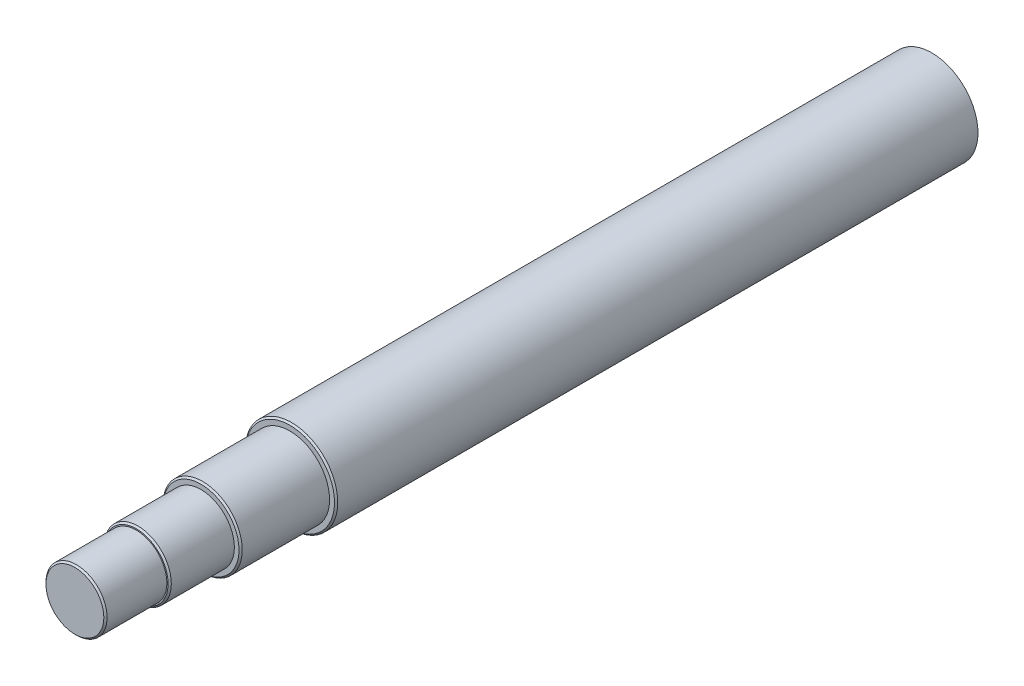
ISO-10303-21;
HEADER;
FILE_DESCRIPTION(('STEP AP214'),'2;1');
FILE_NAME('part.step','',(''),(''),'','','');
FILE_SCHEMA(('AUTOMOTIVE_DESIGN { 1 0 10303 214 1 1 1 1 }'));
ENDSEC;
DATA;
#1=APPLICATION_CONTEXT('core data for automotive mechanical design processes');
#2=APPLICATION_PROTOCOL_DEFINITION('international standard','automotive_design',2000,#1);
#3=PRODUCT_CONTEXT('',#1,'mechanical');
#4=PRODUCT('Part','Part','',(#3));
#5=PRODUCT_RELATED_PRODUCT_CATEGORY('part','',(#4));
#6=PRODUCT_DEFINITION_FORMATION('','',#4);
#7=PRODUCT_DEFINITION_CONTEXT('part definition',#1,'design');
#8=PRODUCT_DEFINITION('design','',#6,#7);
#9=PRODUCT_DEFINITION_SHAPE('','',#8);
#10=(LENGTH_UNIT() NAMED_UNIT(*) SI_UNIT(.MILLI.,.METRE.));
#11=(NAMED_UNIT(*) PLANE_ANGLE_UNIT() SI_UNIT($,.RADIAN.));
#12=(NAMED_UNIT(*) SI_UNIT($,.STERADIAN.) SOLID_ANGLE_UNIT());
#13=UNCERTAINTY_MEASURE_WITH_UNIT(LENGTH_MEASURE(1.E-05),#10,'distance_accuracy_value','');
#14=(GEOMETRIC_REPRESENTATION_CONTEXT(3) GLOBAL_UNCERTAINTY_ASSIGNED_CONTEXT((#13)) GLOBAL_UNIT_ASSIGNED_CONTEXT((#10,
#11,#12)) REPRESENTATION_CONTEXT('',''));
#15=CARTESIAN_POINT('',(0.,0.,0.));
#16=DIRECTION('',(0.,0.,1.));
#17=DIRECTION('',(1.,0.,0.));
#18=AXIS2_PLACEMENT_3D('',#15,#16,#17);
#19=CARTESIAN_POINT('',(0.,0.,452.));
#20=DIRECTION('',(0.,0.,1.));
#21=DIRECTION('',(1.,0.,0.));
#22=AXIS2_PLACEMENT_3D('',#19,#20,#21);
#23=PLANE('',#22);
#24=CARTESIAN_POINT('',(0.,0.,452.));
#25=DIRECTION('',(0.,0.,1.));
#26=DIRECTION('',(1.,0.,0.));
#27=AXIS2_PLACEMENT_3D('',#24,#25,#26);
#28=CIRCLE('',#27,23.5);
#29=CARTESIAN_POINT('',(23.5,0.,452.));
#30=VERTEX_POINT('',#29);
#31=EDGE_CURVE('E86',#30,#30,#28,.T.);
#32=ORIENTED_EDGE('',*,*,#31,.T.);
#33=EDGE_LOOP('',(#32));
#34=FACE_BOUND('',#33,.T.);
#35=CARTESIAN_POINT('',(0.,0.,452.));
#36=DIRECTION('',(0.,0.,1.));
#37=DIRECTION('',(1.,0.,0.));
#38=AXIS2_PLACEMENT_3D('',#35,#36,#37);
#39=CIRCLE('',#38,20.64);
#40=CARTESIAN_POINT('',(20.64,0.,452.));
#41=VERTEX_POINT('',#40);
#42=EDGE_CURVE('E106',#41,#41,#39,.T.);
#43=ORIENTED_EDGE('',*,*,#42,.F.);
#44=EDGE_LOOP('',(#43));
#45=FACE_BOUND('',#44,.T.);
#46=ADVANCED_FACE('F67',(#34,#45),#23,.T.);
#47=CARTESIAN_POINT('',(0.,0.,452.));
#48=DIRECTION('',(0.,0.,1.));
#49=DIRECTION('',(1.,0.,0.));
#50=AXIS2_PLACEMENT_3D('',#47,#48,#49);
#51=CYLINDRICAL_SURFACE('',#50,20.64);
#52=CARTESIAN_POINT('',(0.,0.,491.));
#53=DIRECTION('',(0.,0.,1.));
#54=DIRECTION('',(1.,0.,0.));
#55=AXIS2_PLACEMENT_3D('',#52,#53,#54);
#56=CIRCLE('',#55,20.64);
#57=CARTESIAN_POINT('',(20.64,0.,491.));
#58=VERTEX_POINT('',#57);
#59=EDGE_CURVE('E13',#58,#58,#56,.F.);
#60=ORIENTED_EDGE('',*,*,#59,.T.);
#61=EDGE_LOOP('',(#60));
#62=FACE_BOUND('',#61,.T.);
#63=ORIENTED_EDGE('',*,*,#42,.T.);
#64=EDGE_LOOP('',(#63));
#65=FACE_BOUND('',#64,.T.);
#66=ADVANCED_FACE('F152',(#62,#65),#51,.T.);
#67=CARTESIAN_POINT('',(0.,0.,492.));
#68=DIRECTION('',(0.,0.,1.));
#69=DIRECTION('',(1.,0.,0.));
#70=AXIS2_PLACEMENT_3D('',#67,#68,#69);
#71=PLANE('',#70);
#72=CARTESIAN_POINT('',(0.,0.,492.));
#73=DIRECTION('',(0.,0.,1.));
#74=DIRECTION('',(1.,0.,0.));
#75=AXIS2_PLACEMENT_3D('',#72,#73,#74);
#76=CIRCLE('',#75,19.64);
#77=CARTESIAN_POINT('',(19.64,0.,492.));
#78=VERTEX_POINT('',#77);
#79=EDGE_CURVE('E76',#78,#78,#76,.T.);
#80=ORIENTED_EDGE('',*,*,#79,.T.);
#81=EDGE_LOOP('',(#80));
#82=FACE_BOUND('',#81,.T.);
#83=CARTESIAN_POINT('',(0.,0.,492.));
#84=DIRECTION('',(0.,0.,1.));
#85=DIRECTION('',(1.,0.,0.));
#86=AXIS2_PLACEMENT_3D('',#83,#84,#85);
#87=CIRCLE('',#86,18.9);
#88=CARTESIAN_POINT('',(18.9,0.,492.));
#89=VERTEX_POINT('',#88);
#90=EDGE_CURVE('E101',#89,#89,#87,.T.);
#91=ORIENTED_EDGE('',*,*,#90,.F.);
#92=EDGE_LOOP('',(#91));
#93=FACE_BOUND('',#92,.T.);
#94=ADVANCED_FACE('F158',(#82,#93),#71,.T.);
#95=CARTESIAN_POINT('',(0.,0.,452.));
#96=DIRECTION('',(0.,0.,1.));
#97=DIRECTION('',(1.,0.,0.));
#98=AXIS2_PLACEMENT_3D('',#95,#96,#97);
#99=CYLINDRICAL_SURFACE('',#98,18.9);
#100=CARTESIAN_POINT('',(0.,0.,452.));
#101=DIRECTION('',(0.,0.,1.));
#102=DIRECTION('',(1.,0.,0.));
#103=AXIS2_PLACEMENT_3D('',#100,#101,#102);
#104=CIRCLE('',#103,18.9);
#105=CARTESIAN_POINT('',(18.9,0.,452.));
#106=VERTEX_POINT('',#105);
#107=EDGE_CURVE('E105',#106,#106,#104,.T.);
#108=ORIENTED_EDGE('',*,*,#107,.F.);
#109=EDGE_LOOP('',(#108));
#110=FACE_BOUND('',#109,.T.);
#111=ORIENTED_EDGE('',*,*,#90,.T.);
#112=EDGE_LOOP('',(#111));
#113=FACE_BOUND('',#112,.T.);
#114=ADVANCED_FACE('F196',(#110,#113),#99,.F.);
#115=CARTESIAN_POINT('',(0.,0.,452.));
#116=DIRECTION('',(0.,0.,1.));
#117=DIRECTION('',(1.,0.,0.));
#118=AXIS2_PLACEMENT_3D('',#115,#116,#117);
#119=PLANE('',#118);
#120=ORIENTED_EDGE('',*,*,#107,.T.);
#121=EDGE_LOOP('',(#120));
#122=FACE_BOUND('',#121,.T.);
#123=ADVANCED_FACE('F162',(#122),#119,.T.);
#124=CARTESIAN_POINT('',(0.,0.,397.));
#125=DIRECTION('',(0.,0.,1.));
#126=DIRECTION('',(1.,0.,0.));
#127=AXIS2_PLACEMENT_3D('',#124,#125,#126);
#128=PLANE('',#127);
#129=CARTESIAN_POINT('',(0.,0.,397.));
#130=DIRECTION('',(0.,0.,1.));
#131=DIRECTION('',(1.,0.,0.));
#132=AXIS2_PLACEMENT_3D('',#129,#130,#131);
#133=CIRCLE('',#132,27.5750000000001);
#134=CARTESIAN_POINT('',(27.5750000000001,0.,397.));
#135=VERTEX_POINT('',#134);
#136=EDGE_CURVE('E96',#135,#135,#133,.T.);
#137=ORIENTED_EDGE('',*,*,#136,.T.);
#138=EDGE_LOOP('',(#137));
#139=FACE_BOUND('',#138,.T.);
#140=CARTESIAN_POINT('',(0.,0.,397.));
#141=DIRECTION('',(0.,0.,1.));
#142=DIRECTION('',(1.,0.,0.));
#143=AXIS2_PLACEMENT_3D('',#140,#141,#142);
#144=CIRCLE('',#143,24.5);
#145=CARTESIAN_POINT('',(24.5,0.,397.));
#146=VERTEX_POINT('',#145);
#147=EDGE_CURVE('E117',#146,#146,#144,.T.);
#148=ORIENTED_EDGE('',*,*,#147,.F.);
#149=EDGE_LOOP('',(#148));
#150=FACE_BOUND('',#149,.T.);
#151=ADVANCED_FACE('F187',(#139,#150),#128,.T.);
#152=CARTESIAN_POINT('',(0.,0.,397.));
#153=DIRECTION('',(0.,0.,1.));
#154=DIRECTION('',(1.,0.,0.));
#155=AXIS2_PLACEMENT_3D('',#152,#153,#154);
#156=CYLINDRICAL_SURFACE('',#155,24.5);
#157=CARTESIAN_POINT('',(0.,0.,451.));
#158=DIRECTION('',(0.,0.,1.));
#159=DIRECTION('',(1.,0.,0.));
#160=AXIS2_PLACEMENT_3D('',#157,#158,#159);
#161=CIRCLE('',#160,24.5);
#162=CARTESIAN_POINT('',(24.5,0.,451.));
#163=VERTEX_POINT('',#162);
#164=EDGE_CURVE('E81',#163,#163,#161,.F.);
#165=ORIENTED_EDGE('',*,*,#164,.T.);
#166=EDGE_LOOP('',(#165));
#167=FACE_BOUND('',#166,.T.);
#168=ORIENTED_EDGE('',*,*,#147,.T.);
#169=EDGE_LOOP('',(#168));
#170=FACE_BOUND('',#169,.T.);
#171=ADVANCED_FACE('F141',(#167,#170),#156,.T.);
#172=CARTESIAN_POINT('',(0.,0.,0.));
#173=DIRECTION('',(0.,0.,1.));
#174=DIRECTION('',(1.,0.,0.));
#175=AXIS2_PLACEMENT_3D('',#172,#173,#174);
#176=PLANE('',#175);
#177=CARTESIAN_POINT('',(0.,0.,0.));
#178=DIRECTION('',(0.,0.,-1.));
#179=DIRECTION('',(-1.,0.,0.));
#180=AXIS2_PLACEMENT_3D('',#177,#178,#179);
#181=CIRCLE('',#180,5.);
#182=CARTESIAN_POINT('',(-5.,0.,0.));
#183=VERTEX_POINT('',#182);
#184=EDGE_CURVE('E100',#183,#183,#181,.T.);
#185=ORIENTED_EDGE('',*,*,#184,.F.);
#186=EDGE_LOOP('',(#185));
#187=FACE_BOUND('',#186,.T.);
#188=CARTESIAN_POINT('',(0.,0.,0.));
#189=DIRECTION('',(0.,0.,1.));
#190=DIRECTION('',(1.,0.,0.));
#191=AXIS2_PLACEMENT_3D('',#188,#189,#190);
#192=CIRCLE('',#191,28.575);
#193=CARTESIAN_POINT('',(28.575,0.,0.));
#194=VERTEX_POINT('',#193);
#195=EDGE_CURVE('E110',#194,#194,#192,.T.);
#196=ORIENTED_EDGE('',*,*,#195,.F.);
#197=EDGE_LOOP('',(#196));
#198=FACE_BOUND('',#197,.T.);
#199=ADVANCED_FACE('F138',(#187,#198),#176,.F.);
#200=CARTESIAN_POINT('',(0.,0.,530.));
#201=DIRECTION('',(0.,0.,-1.));
#202=DIRECTION('',(-1.,0.,0.));
#203=AXIS2_PLACEMENT_3D('',#200,#201,#202);
#204=CYLINDRICAL_SURFACE('',#203,28.575);
#205=CARTESIAN_POINT('',(0.,0.,396.));
#206=DIRECTION('',(0.,0.,1.));
#207=DIRECTION('',(1.,0.,0.));
#208=AXIS2_PLACEMENT_3D('',#205,#206,#207);
#209=CIRCLE('',#208,28.575);
#210=CARTESIAN_POINT('',(28.575,0.,396.));
#211=VERTEX_POINT('',#210);
#212=EDGE_CURVE('E92',#211,#211,#209,.F.);
#213=ORIENTED_EDGE('',*,*,#212,.T.);
#214=EDGE_LOOP('',(#213));
#215=FACE_BOUND('',#214,.T.);
#216=ORIENTED_EDGE('',*,*,#195,.T.);
#217=EDGE_LOOP('',(#216));
#218=FACE_BOUND('',#217,.T.);
#219=ADVANCED_FACE('F134',(#215,#218),#204,.T.);
#220=CARTESIAN_POINT('',(0.,0.,-5.));
#221=DIRECTION('',(0.,0.,1.));
#222=DIRECTION('',(1.,0.,0.));
#223=AXIS2_PLACEMENT_3D('',#220,#221,#222);
#224=CYLINDRICAL_SURFACE('',#223,5.);
#225=CARTESIAN_POINT('',(0.,0.,-5.));
#226=DIRECTION('',(0.,0.,-1.));
#227=DIRECTION('',(-1.,0.,0.));
#228=AXIS2_PLACEMENT_3D('',#225,#226,#227);
#229=CIRCLE('',#228,5.);
#230=CARTESIAN_POINT('',(-5.,0.,-5.));
#231=VERTEX_POINT('',#230);
#232=EDGE_CURVE('E121',#231,#231,#229,.T.);
#233=ORIENTED_EDGE('',*,*,#232,.F.);
#234=EDGE_LOOP('',(#233));
#235=FACE_BOUND('',#234,.T.);
#236=ORIENTED_EDGE('',*,*,#184,.T.);
#237=EDGE_LOOP('',(#236));
#238=FACE_BOUND('',#237,.T.);
#239=ADVANCED_FACE('F131',(#235,#238),#224,.T.);
#240=CARTESIAN_POINT('',(0.,0.,-5.));
#241=DIRECTION('',(0.,0.,-1.));
#242=DIRECTION('',(-1.,0.,0.));
#243=AXIS2_PLACEMENT_3D('',#240,#241,#242);
#244=PLANE('',#243);
#245=ORIENTED_EDGE('',*,*,#232,.T.);
#246=EDGE_LOOP('',(#245));
#247=FACE_BOUND('',#246,.T.);
#248=ADVANCED_FACE('F129',(#247),#244,.T.);
#249=CARTESIAN_POINT('',(0.,0.,397.));
#250=DIRECTION('',(0.,0.,-1.));
#251=DIRECTION('',(-1.,0.,0.));
#252=AXIS2_PLACEMENT_3D('',#249,#250,#251);
#253=CONICAL_SURFACE('',#252,27.5750000000001,0.785398163397414);
#254=ORIENTED_EDGE('',*,*,#212,.F.);
#255=EDGE_LOOP('',(#254));
#256=FACE_BOUND('',#255,.T.);
#257=ORIENTED_EDGE('',*,*,#136,.F.);
#258=EDGE_LOOP('',(#257));
#259=FACE_BOUND('',#258,.T.);
#260=ADVANCED_FACE('F166',(#256,#259),#253,.T.);
#261=CARTESIAN_POINT('',(0.,0.,452.));
#262=DIRECTION('',(0.,0.,-1.));
#263=DIRECTION('',(-1.,0.,0.));
#264=AXIS2_PLACEMENT_3D('',#261,#262,#263);
#265=CONICAL_SURFACE('',#264,23.5,0.785398163397438);
#266=ORIENTED_EDGE('',*,*,#164,.F.);
#267=EDGE_LOOP('',(#266));
#268=FACE_BOUND('',#267,.T.);
#269=ORIENTED_EDGE('',*,*,#31,.F.);
#270=EDGE_LOOP('',(#269));
#271=FACE_BOUND('',#270,.T.);
#272=ADVANCED_FACE('F171',(#268,#271),#265,.T.);
#273=CARTESIAN_POINT('',(0.,0.,492.));
#274=DIRECTION('',(0.,0.,-1.));
#275=DIRECTION('',(-1.,0.,0.));
#276=AXIS2_PLACEMENT_3D('',#273,#274,#275);
#277=CONICAL_SURFACE('',#276,19.64,0.785398163397426);
#278=ORIENTED_EDGE('',*,*,#59,.F.);
#279=EDGE_LOOP('',(#278));
#280=FACE_BOUND('',#279,.T.);
#281=ORIENTED_EDGE('',*,*,#79,.F.);
#282=EDGE_LOOP('',(#281));
#283=FACE_BOUND('',#282,.T.);
#284=ADVANCED_FACE('F70',(#280,#283),#277,.T.);
#285=CLOSED_SHELL('',(#46,#66,#94,#114,#123,#151,#171,#199,#219,#239,#248,#260,#272,#284));
#286=MANIFOLD_SOLID_BREP('B2',#285);
#287=CARTESIAN_POINT('',(0.,0.,530.));
#288=DIRECTION('',(0.,0.,1.));
#289=DIRECTION('',(1.,0.,0.));
#290=AXIS2_PLACEMENT_3D('',#287,#288,#289);
#291=PLANE('',#290);
#292=CARTESIAN_POINT('',(0.,0.,530.));
#293=DIRECTION('',(0.,0.,1.));
#294=DIRECTION('',(1.,0.,0.));
#295=AXIS2_PLACEMENT_3D('',#292,#293,#294);
#296=CIRCLE('',#295,17.9);
#297=CARTESIAN_POINT('',(17.9,0.,530.));
#298=VERTEX_POINT('',#297);
#299=EDGE_CURVE('E327',#298,#298,#296,.T.);
#300=ORIENTED_EDGE('',*,*,#299,.T.);
#301=EDGE_LOOP('',(#300));
#302=FACE_BOUND('',#301,.T.);
#303=ADVANCED_FACE('F319',(#302),#291,.T.);
#304=CARTESIAN_POINT('',(0.,0.,492.));
#305=DIRECTION('',(0.,0.,1.));
#306=DIRECTION('',(1.,0.,0.));
#307=AXIS2_PLACEMENT_3D('',#304,#305,#306);
#308=CYLINDRICAL_SURFACE('',#307,18.9);
#309=CARTESIAN_POINT('',(0.,0.,529.));
#310=DIRECTION('',(0.,0.,1.));
#311=DIRECTION('',(1.,0.,0.));
#312=AXIS2_PLACEMENT_3D('',#309,#310,#311);
#313=CIRCLE('',#312,18.9);
#314=CARTESIAN_POINT('',(18.9,0.,529.));
#315=VERTEX_POINT('',#314);
#316=EDGE_CURVE('E66',#315,#315,#313,.F.);
#317=ORIENTED_EDGE('',*,*,#316,.T.);
#318=EDGE_LOOP('',(#317));
#319=FACE_BOUND('',#318,.T.);
#320=CARTESIAN_POINT('',(0.,0.,492.));
#321=DIRECTION('',(0.,0.,1.));
#322=DIRECTION('',(1.,0.,0.));
#323=AXIS2_PLACEMENT_3D('',#320,#321,#322);
#324=CIRCLE('',#323,18.9);
#325=CARTESIAN_POINT('',(18.9,0.,492.));
#326=VERTEX_POINT('',#325);
#327=EDGE_CURVE('E331',#326,#326,#324,.T.);
#328=ORIENTED_EDGE('',*,*,#327,.T.);
#329=EDGE_LOOP('',(#328));
#330=FACE_BOUND('',#329,.T.);
#331=ADVANCED_FACE('F338',(#319,#330),#308,.T.);
#332=CARTESIAN_POINT('',(0.,0.,492.));
#333=DIRECTION('',(0.,0.,1.));
#334=DIRECTION('',(1.,0.,0.));
#335=AXIS2_PLACEMENT_3D('',#332,#333,#334);
#336=PLANE('',#335);
#337=ORIENTED_EDGE('',*,*,#327,.F.);
#338=EDGE_LOOP('',(#337));
#339=FACE_BOUND('',#338,.T.);
#340=ADVANCED_FACE('F340',(#339),#336,.F.);
#341=CARTESIAN_POINT('',(0.,0.,530.));
#342=DIRECTION('',(0.,0.,-1.));
#343=DIRECTION('',(-1.,0.,0.));
#344=AXIS2_PLACEMENT_3D('',#341,#342,#343);
#345=CONICAL_SURFACE('',#344,17.9,0.785398163397448);
#346=ORIENTED_EDGE('',*,*,#316,.F.);
#347=EDGE_LOOP('',(#346));
#348=FACE_BOUND('',#347,.T.);
#349=ORIENTED_EDGE('',*,*,#299,.F.);
#350=EDGE_LOOP('',(#349));
#351=FACE_BOUND('',#350,.T.);
#352=ADVANCED_FACE('F322',(#348,#351),#345,.T.);
#353=CLOSED_SHELL('',(#303,#331,#340,#352));
#354=MANIFOLD_SOLID_BREP('B8',#353);
#355=ADVANCED_BREP_SHAPE_REPRESENTATION('',(#18,#286,#354),#14);
#356=SHAPE_DEFINITION_REPRESENTATION(#9,#355);
ENDSEC;
END-ISO-10303-21;
